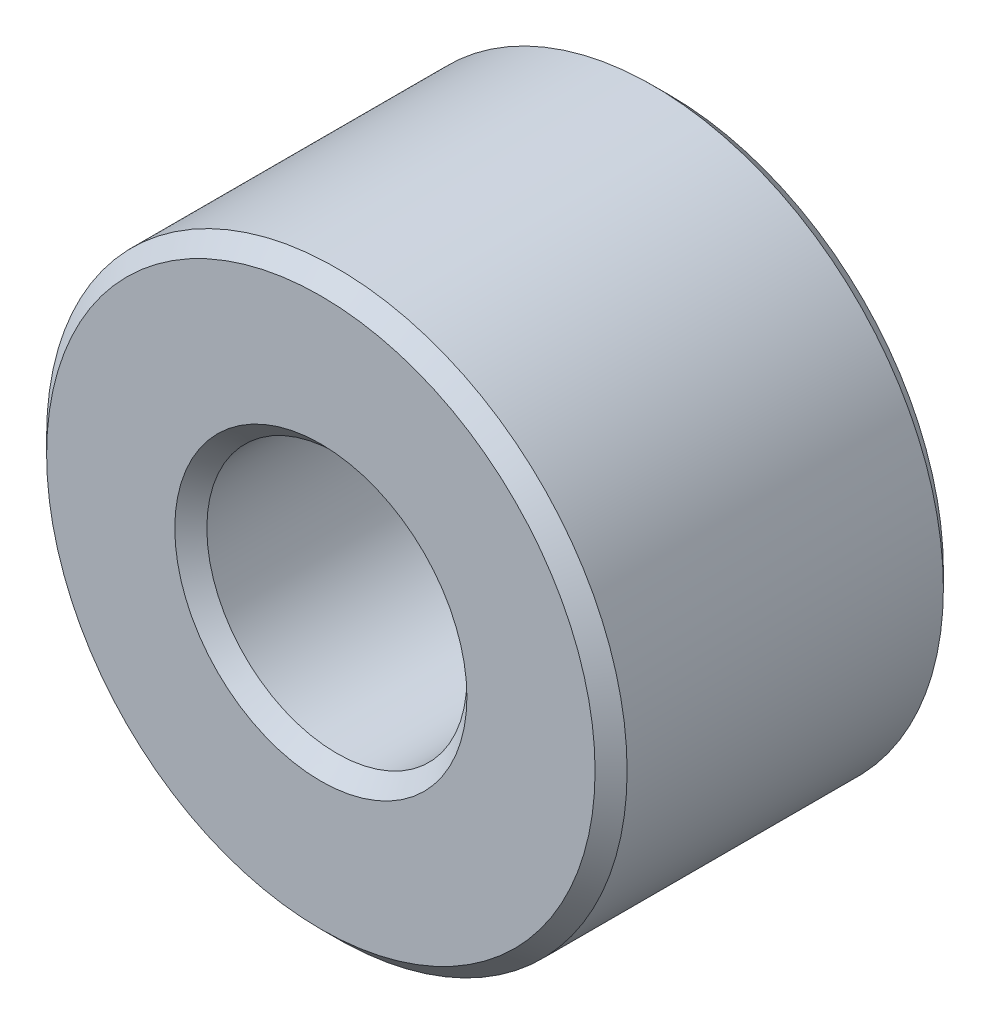
ISO-10303-21;
HEADER;
FILE_DESCRIPTION(('STEP AP214'),'2;1');
FILE_NAME('part.step','',(''),(''),'','','');
FILE_SCHEMA(('AUTOMOTIVE_DESIGN { 1 0 10303 214 1 1 1 1 }'));
ENDSEC;
DATA;
#1=APPLICATION_CONTEXT('core data for automotive mechanical design processes');
#2=APPLICATION_PROTOCOL_DEFINITION('international standard','automotive_design',2000,#1);
#3=PRODUCT_CONTEXT('',#1,'mechanical');
#4=PRODUCT('Part','Part','',(#3));
#5=PRODUCT_RELATED_PRODUCT_CATEGORY('part','',(#4));
#6=PRODUCT_DEFINITION_FORMATION('','',#4);
#7=PRODUCT_DEFINITION_CONTEXT('part definition',#1,'design');
#8=PRODUCT_DEFINITION('design','',#6,#7);
#9=PRODUCT_DEFINITION_SHAPE('','',#8);
#10=(LENGTH_UNIT() NAMED_UNIT(*) SI_UNIT(.MILLI.,.METRE.));
#11=(NAMED_UNIT(*) PLANE_ANGLE_UNIT() SI_UNIT($,.RADIAN.));
#12=(NAMED_UNIT(*) SI_UNIT($,.STERADIAN.) SOLID_ANGLE_UNIT());
#13=UNCERTAINTY_MEASURE_WITH_UNIT(LENGTH_MEASURE(1.E-05),#10,'distance_accuracy_value','');
#14=(GEOMETRIC_REPRESENTATION_CONTEXT(3) GLOBAL_UNCERTAINTY_ASSIGNED_CONTEXT((#13)) GLOBAL_UNIT_ASSIGNED_CONTEXT((#10,
#11,#12)) REPRESENTATION_CONTEXT('',''));
#15=CARTESIAN_POINT('',(0.,0.,0.));
#16=DIRECTION('',(0.,0.,1.));
#17=DIRECTION('',(1.,0.,0.));
#18=AXIS2_PLACEMENT_3D('',#15,#16,#17);
#19=CARTESIAN_POINT('',(0.,0.,-2.38125));
#20=DIRECTION('',(0.,0.,1.));
#21=DIRECTION('',(1.,0.,0.));
#22=AXIS2_PLACEMENT_3D('',#19,#20,#21);
#23=CYLINDRICAL_SURFACE('',#22,3.96875);
#24=CARTESIAN_POINT('',(0.,0.,2.162175));
#25=DIRECTION('',(0.,0.,1.));
#26=DIRECTION('',(1.,0.,0.));
#27=AXIS2_PLACEMENT_3D('',#24,#25,#26);
#28=CIRCLE('',#27,3.96875);
#29=CARTESIAN_POINT('',(3.96875,0.,2.162175));
#30=VERTEX_POINT('',#29);
#31=EDGE_CURVE('E65',#30,#30,#28,.F.);
#32=ORIENTED_EDGE('',*,*,#31,.T.);
#33=EDGE_LOOP('',(#32));
#34=FACE_BOUND('',#33,.T.);
#35=CARTESIAN_POINT('',(0.,0.,-2.162175));
#36=DIRECTION('',(0.,0.,1.));
#37=DIRECTION('',(1.,0.,0.));
#38=AXIS2_PLACEMENT_3D('',#35,#36,#37);
#39=CIRCLE('',#38,3.96875);
#40=CARTESIAN_POINT('',(3.96875,0.,-2.162175));
#41=VERTEX_POINT('',#40);
#42=EDGE_CURVE('E69',#41,#41,#39,.T.);
#43=ORIENTED_EDGE('',*,*,#42,.T.);
#44=EDGE_LOOP('',(#43));
#45=FACE_BOUND('',#44,.T.);
#46=ADVANCED_FACE('F39',(#34,#45),#23,.T.);
#47=CARTESIAN_POINT('',(0.,0.,-2.38125));
#48=DIRECTION('',(0.,0.,1.));
#49=DIRECTION('',(1.,0.,0.));
#50=AXIS2_PLACEMENT_3D('',#47,#48,#49);
#51=PLANE('',#50);
#52=CARTESIAN_POINT('',(0.,0.,-2.38125));
#53=DIRECTION('',(0.,0.,1.));
#54=DIRECTION('',(1.,0.,0.));
#55=AXIS2_PLACEMENT_3D('',#52,#53,#54);
#56=CIRCLE('',#55,3.749675);
#57=CARTESIAN_POINT('',(3.749675,0.,-2.38125));
#58=VERTEX_POINT('',#57);
#59=EDGE_CURVE('E53',#58,#58,#56,.F.);
#60=ORIENTED_EDGE('',*,*,#59,.T.);
#61=EDGE_LOOP('',(#60));
#62=FACE_BOUND('',#61,.T.);
#63=CARTESIAN_POINT('',(0.,0.,-2.38125));
#64=DIRECTION('',(0.,0.,1.));
#65=DIRECTION('',(1.,0.,0.));
#66=AXIS2_PLACEMENT_3D('',#63,#64,#65);
#67=CIRCLE('',#66,1.997075);
#68=CARTESIAN_POINT('',(1.997075,0.,-2.38125));
#69=VERTEX_POINT('',#68);
#70=EDGE_CURVE('E59',#69,#69,#67,.T.);
#71=ORIENTED_EDGE('',*,*,#70,.T.);
#72=EDGE_LOOP('',(#71));
#73=FACE_BOUND('',#72,.T.);
#74=ADVANCED_FACE('F98',(#62,#73),#51,.F.);
#75=CARTESIAN_POINT('',(0.,0.,-2.38125));
#76=DIRECTION('',(0.,0.,1.));
#77=DIRECTION('',(1.,0.,0.));
#78=AXIS2_PLACEMENT_3D('',#75,#76,#77);
#79=CYLINDRICAL_SURFACE('',#78,1.778);
#80=CARTESIAN_POINT('',(0.,0.,2.162175));
#81=DIRECTION('',(0.,0.,1.));
#82=DIRECTION('',(1.,0.,0.));
#83=AXIS2_PLACEMENT_3D('',#80,#81,#82);
#84=CIRCLE('',#83,1.778);
#85=CARTESIAN_POINT('',(1.778,0.,2.162175));
#86=VERTEX_POINT('',#85);
#87=EDGE_CURVE('E10',#86,#86,#84,.T.);
#88=ORIENTED_EDGE('',*,*,#87,.T.);
#89=EDGE_LOOP('',(#88));
#90=FACE_BOUND('',#89,.T.);
#91=CARTESIAN_POINT('',(0.,0.,-2.162175));
#92=DIRECTION('',(0.,0.,1.));
#93=DIRECTION('',(1.,0.,0.));
#94=AXIS2_PLACEMENT_3D('',#91,#92,#93);
#95=CIRCLE('',#94,1.778);
#96=CARTESIAN_POINT('',(1.778,0.,-2.162175));
#97=VERTEX_POINT('',#96);
#98=EDGE_CURVE('E47',#97,#97,#95,.F.);
#99=ORIENTED_EDGE('',*,*,#98,.T.);
#100=EDGE_LOOP('',(#99));
#101=FACE_BOUND('',#100,.T.);
#102=ADVANCED_FACE('F104',(#90,#101),#79,.F.);
#103=CARTESIAN_POINT('',(0.,0.,2.38125));
#104=DIRECTION('',(0.,0.,1.));
#105=DIRECTION('',(1.,0.,0.));
#106=AXIS2_PLACEMENT_3D('',#103,#104,#105);
#107=PLANE('',#106);
#108=CARTESIAN_POINT('',(0.,0.,2.38125));
#109=DIRECTION('',(0.,0.,1.));
#110=DIRECTION('',(1.,0.,0.));
#111=AXIS2_PLACEMENT_3D('',#108,#109,#110);
#112=CIRCLE('',#111,3.749675);
#113=CARTESIAN_POINT('',(3.749675,0.,2.38125));
#114=VERTEX_POINT('',#113);
#115=EDGE_CURVE('E73',#114,#114,#112,.T.);
#116=ORIENTED_EDGE('',*,*,#115,.T.);
#117=EDGE_LOOP('',(#116));
#118=FACE_BOUND('',#117,.T.);
#119=CARTESIAN_POINT('',(0.,0.,2.38125));
#120=DIRECTION('',(0.,0.,1.));
#121=DIRECTION('',(1.,0.,0.));
#122=AXIS2_PLACEMENT_3D('',#119,#120,#121);
#123=CIRCLE('',#122,1.997075);
#124=CARTESIAN_POINT('',(1.997075,0.,2.38125));
#125=VERTEX_POINT('',#124);
#126=EDGE_CURVE('E77',#125,#125,#123,.F.);
#127=ORIENTED_EDGE('',*,*,#126,.T.);
#128=EDGE_LOOP('',(#127));
#129=FACE_BOUND('',#128,.T.);
#130=ADVANCED_FACE('F83',(#118,#129),#107,.T.);
#131=CARTESIAN_POINT('',(0.,0.,2.38125));
#132=DIRECTION('',(0.,0.,-1.));
#133=DIRECTION('',(-1.,0.,0.));
#134=AXIS2_PLACEMENT_3D('',#131,#132,#133);
#135=CONICAL_SURFACE('',#134,3.749675,0.785398163397448);
#136=ORIENTED_EDGE('',*,*,#31,.F.);
#137=EDGE_LOOP('',(#136));
#138=FACE_BOUND('',#137,.T.);
#139=ORIENTED_EDGE('',*,*,#115,.F.);
#140=EDGE_LOOP('',(#139));
#141=FACE_BOUND('',#140,.T.);
#142=ADVANCED_FACE('F94',(#138,#141),#135,.T.);
#143=CARTESIAN_POINT('',(0.,0.,-2.162175));
#144=DIRECTION('',(0.,0.,1.));
#145=DIRECTION('',(1.,0.,0.));
#146=AXIS2_PLACEMENT_3D('',#143,#144,#145);
#147=CONICAL_SURFACE('',#146,3.96875,0.785398163397448);
#148=CARTESIAN_POINT('',(3.749675,0.,-2.38125));
#149=CARTESIAN_POINT('',(3.75195703125,0.,-2.37896796875));
#150=CARTESIAN_POINT('',(3.7542390625,0.,-2.3766859375));
#151=CARTESIAN_POINT('',(3.758803125,0.,-2.372121875));
#152=CARTESIAN_POINT('',(3.76108515625,0.,-2.36983984375));
#153=CARTESIAN_POINT('',(3.76564921875,0.,-2.36527578125));
#154=CARTESIAN_POINT('',(3.76793125,0.,-2.36299375));
#155=CARTESIAN_POINT('',(3.7724953125,0.,-2.3584296875));
#156=CARTESIAN_POINT('',(3.77477734375,0.,-2.35614765625));
#157=CARTESIAN_POINT('',(3.77934140625,0.,-2.35158359375));
#158=CARTESIAN_POINT('',(3.7816234375,0.,-2.3493015625));
#159=CARTESIAN_POINT('',(3.7861875,0.,-2.3447375));
#160=CARTESIAN_POINT('',(3.78846953125,0.,-2.34245546875));
#161=CARTESIAN_POINT('',(3.79303359375,0.,-2.33789140625));
#162=CARTESIAN_POINT('',(3.795315625,0.,-2.335609375));
#163=CARTESIAN_POINT('',(3.7998796875,0.,-2.3310453125));
#164=CARTESIAN_POINT('',(3.80216171875,0.,-2.32876328125));
#165=CARTESIAN_POINT('',(3.80672578125,0.,-2.32419921875));
#166=CARTESIAN_POINT('',(3.8090078125,0.,-2.3219171875));
#167=CARTESIAN_POINT('',(3.813571875,0.,-2.317353125));
#168=CARTESIAN_POINT('',(3.81585390625,0.,-2.31507109375));
#169=CARTESIAN_POINT('',(3.82041796875,0.,-2.31050703125));
#170=CARTESIAN_POINT('',(3.8227,0.,-2.308225));
#171=CARTESIAN_POINT('',(3.8272640625,0.,-2.3036609375));
#172=CARTESIAN_POINT('',(3.82954609375,0.,-2.30137890625));
#173=CARTESIAN_POINT('',(3.83411015625,0.,-2.29681484375));
#174=CARTESIAN_POINT('',(3.8363921875,0.,-2.2945328125));
#175=CARTESIAN_POINT('',(3.84095625,0.,-2.28996875));
#176=CARTESIAN_POINT('',(3.84323828125,0.,-2.28768671875));
#177=CARTESIAN_POINT('',(3.84780234375,0.,-2.28312265625));
#178=CARTESIAN_POINT('',(3.850084375,0.,-2.280840625));
#179=CARTESIAN_POINT('',(3.8546484375,0.,-2.2762765625));
#180=CARTESIAN_POINT('',(3.85693046875,0.,-2.27399453125));
#181=CARTESIAN_POINT('',(3.86149453125,0.,-2.26943046875));
#182=CARTESIAN_POINT('',(3.8637765625,0.,-2.2671484375));
#183=CARTESIAN_POINT('',(3.868340625,0.,-2.262584375));
#184=CARTESIAN_POINT('',(3.87062265625,0.,-2.26030234375));
#185=CARTESIAN_POINT('',(3.87518671875,0.,-2.25573828125));
#186=CARTESIAN_POINT('',(3.87746875,0.,-2.25345625));
#187=CARTESIAN_POINT('',(3.8820328125,0.,-2.2488921875));
#188=CARTESIAN_POINT('',(3.88431484375,0.,-2.24661015625));
#189=CARTESIAN_POINT('',(3.88887890625,0.,-2.24204609375));
#190=CARTESIAN_POINT('',(3.8911609375,0.,-2.2397640625));
#191=CARTESIAN_POINT('',(3.895725,0.,-2.2352));
#192=CARTESIAN_POINT('',(3.89800703125,0.,-2.23291796875));
#193=CARTESIAN_POINT('',(3.90257109375,0.,-2.22835390625));
#194=CARTESIAN_POINT('',(3.904853125,0.,-2.226071875));
#195=CARTESIAN_POINT('',(3.9094171875,0.,-2.2215078125));
#196=CARTESIAN_POINT('',(3.91169921875,0.,-2.21922578125));
#197=CARTESIAN_POINT('',(3.91626328125,0.,-2.21466171875));
#198=CARTESIAN_POINT('',(3.9185453125,0.,-2.2123796875));
#199=CARTESIAN_POINT('',(3.923109375,0.,-2.207815625));
#200=CARTESIAN_POINT('',(3.92539140625,0.,-2.20553359375));
#201=CARTESIAN_POINT('',(3.92995546875,0.,-2.20096953125));
#202=CARTESIAN_POINT('',(3.9322375,0.,-2.1986875));
#203=CARTESIAN_POINT('',(3.9368015625,0.,-2.1941234375));
#204=CARTESIAN_POINT('',(3.93908359375,0.,-2.19184140625));
#205=CARTESIAN_POINT('',(3.94364765625,0.,-2.18727734375));
#206=CARTESIAN_POINT('',(3.9459296875,0.,-2.1849953125));
#207=CARTESIAN_POINT('',(3.95049375,0.,-2.18043125));
#208=CARTESIAN_POINT('',(3.95277578125,0.,-2.17814921875));
#209=CARTESIAN_POINT('',(3.95733984375,0.,-2.17358515625));
#210=CARTESIAN_POINT('',(3.959621875,0.,-2.171303125));
#211=CARTESIAN_POINT('',(3.9641859375,0.,-2.1667390625));
#212=CARTESIAN_POINT('',(3.96646796875,0.,-2.16445703125));
#213=CARTESIAN_POINT('',(3.96875,0.,-2.162175));
#214=B_SPLINE_CURVE_WITH_KNOTS('',3,(#148,#149,#150,#151,#152,#153,#154,#155,#156,#157,#158,
#159,#160,#161,#162,#163,#164,#165,#166,#167,#168,#169,#170,#171,#172,#173,#174,#175,#176,#177,
#178,#179,#180,#181,#182,#183,#184,#185,#186,#187,#188,#189,#190,#191,#192,#193,#194,#195,#196,
#197,#198,#199,#200,#201,#202,#203,#204,#205,#206,#207,#208,#209,#210,#211,#212,#213),
.UNSPECIFIED.,.F.,.F.,(4,2,2,2,2,2,2,2,2,2,2,2,2,2,2,2,2,2,2,2,2,2,2,2,2,2,2,2,2,2,2,2,4),(0.,
0.00968183863052826,0.0193636772610559,0.0290455158915835,0.0387273545221118,0.0484091931526394,
0.0580910317831671,0.0677728704136953,0.077454709044223,0.0871365476747506,0.0968183863052786,
0.106500224935807,0.116182063566334,0.125863902196862,0.13554574082739,0.145227579457918,
0.154909418088445,0.164591256718974,0.174273095349501,0.183954933980029,0.193636772610557,
0.203318611241085,0.213000449871612,0.222682288502141,0.232364127132668,0.242045965763196,
0.251727804393724,0.261409643024252,0.27109148165478,0.280773320285308,0.290455158915835,
0.300136997546363,0.309818836176891),.UNSPECIFIED.);
#215=EDGE_CURVE('BSEAM88',#58,#41,#214,.T.);
#216=ORIENTED_EDGE('',*,*,#59,.F.);
#217=ORIENTED_EDGE('',*,*,#42,.F.);
#218=ORIENTED_EDGE('',*,*,#215,.T.);
#219=ORIENTED_EDGE('',*,*,#215,.F.);
#220=EDGE_LOOP('',(#216,#218,#217,#219));
#221=FACE_BOUND('',#220,.T.);
#222=ADVANCED_FACE('F88',(#221),#147,.T.);
#223=CARTESIAN_POINT('',(0.,0.,2.162175));
#224=DIRECTION('',(0.,0.,1.));
#225=DIRECTION('',(1.,0.,0.));
#226=AXIS2_PLACEMENT_3D('',#223,#224,#225);
#227=CONICAL_SURFACE('',#226,1.778,0.78539816339745);
#228=ORIENTED_EDGE('',*,*,#126,.F.);
#229=EDGE_LOOP('',(#228));
#230=FACE_BOUND('',#229,.T.);
#231=ORIENTED_EDGE('',*,*,#87,.F.);
#232=EDGE_LOOP('',(#231));
#233=FACE_BOUND('',#232,.T.);
#234=ADVANCED_FACE('F85',(#230,#233),#227,.F.);
#235=CARTESIAN_POINT('',(0.,0.,-2.38125));
#236=DIRECTION('',(0.,0.,-1.));
#237=DIRECTION('',(-1.,0.,0.));
#238=AXIS2_PLACEMENT_3D('',#235,#236,#237);
#239=CONICAL_SURFACE('',#238,1.997075,0.785398163397448);
#240=ORIENTED_EDGE('',*,*,#98,.F.);
#241=EDGE_LOOP('',(#240));
#242=FACE_BOUND('',#241,.T.);
#243=ORIENTED_EDGE('',*,*,#70,.F.);
#244=EDGE_LOOP('',(#243));
#245=FACE_BOUND('',#244,.T.);
#246=ADVANCED_FACE('F41',(#242,#245),#239,.F.);
#247=CLOSED_SHELL('',(#46,#74,#102,#130,#142,#222,#234,#246));
#248=MANIFOLD_SOLID_BREP('B2',#247);
#249=ADVANCED_BREP_SHAPE_REPRESENTATION('',(#18,#248),#14);
#250=SHAPE_DEFINITION_REPRESENTATION(#9,#249);
ENDSEC;
END-ISO-10303-21;
